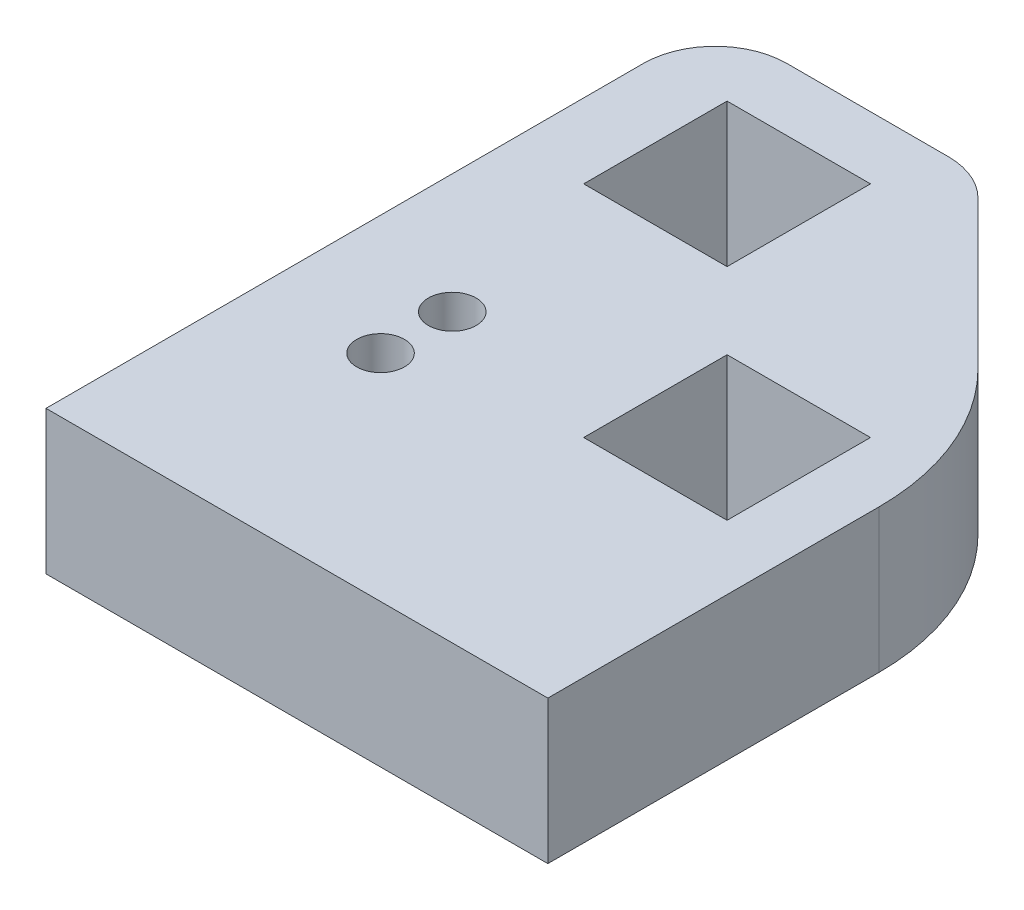
ISO-10303-21;
HEADER;
FILE_DESCRIPTION(('STEP AP214'),'2;1');
FILE_NAME('part.step','',(''),(''),'','','');
FILE_SCHEMA(('AUTOMOTIVE_DESIGN { 1 0 10303 214 1 1 1 1 }'));
ENDSEC;
DATA;
#1=APPLICATION_CONTEXT('core data for automotive mechanical design processes');
#2=APPLICATION_PROTOCOL_DEFINITION('international standard','automotive_design',2000,#1);
#3=PRODUCT_CONTEXT('',#1,'mechanical');
#4=PRODUCT('Part','Part','',(#3));
#5=PRODUCT_RELATED_PRODUCT_CATEGORY('part','',(#4));
#6=PRODUCT_DEFINITION_FORMATION('','',#4);
#7=PRODUCT_DEFINITION_CONTEXT('part definition',#1,'design');
#8=PRODUCT_DEFINITION('design','',#6,#7);
#9=PRODUCT_DEFINITION_SHAPE('','',#8);
#10=(LENGTH_UNIT() NAMED_UNIT(*) SI_UNIT(.MILLI.,.METRE.));
#11=(NAMED_UNIT(*) PLANE_ANGLE_UNIT() SI_UNIT($,.RADIAN.));
#12=(NAMED_UNIT(*) SI_UNIT($,.STERADIAN.) SOLID_ANGLE_UNIT());
#13=UNCERTAINTY_MEASURE_WITH_UNIT(LENGTH_MEASURE(1.E-05),#10,'distance_accuracy_value','');
#14=(GEOMETRIC_REPRESENTATION_CONTEXT(3) GLOBAL_UNCERTAINTY_ASSIGNED_CONTEXT((#13)) GLOBAL_UNIT_ASSIGNED_CONTEXT((#10,
#11,#12)) REPRESENTATION_CONTEXT('',''));
#15=CARTESIAN_POINT('',(0.,0.,0.));
#16=DIRECTION('',(0.,0.,1.));
#17=DIRECTION('',(1.,0.,0.));
#18=AXIS2_PLACEMENT_3D('',#15,#16,#17);
#19=CARTESIAN_POINT('',(0.,6.,0.));
#20=DIRECTION('',(1.,0.,0.));
#21=DIRECTION('',(0.,0.,-1.));
#22=AXIS2_PLACEMENT_3D('',#19,#20,#21);
#23=PLANE('',#22);
#24=DIRECTION('',(0.,0.,1.));
#25=VECTOR('',#24,1.);
#26=CARTESIAN_POINT('',(0.,6.,0.));
#27=LINE('',#26,#25);
#28=CARTESIAN_POINT('',(0.,6.,-25.));
#29=VERTEX_POINT('',#28);
#30=CARTESIAN_POINT('',(0.,6.,0.));
#31=VERTEX_POINT('',#30);
#32=EDGE_CURVE('E232',#29,#31,#27,.T.);
#33=ORIENTED_EDGE('',*,*,#32,.F.);
#34=DIRECTION('',(0.,-1.,0.));
#35=VECTOR('',#34,1.);
#36=CARTESIAN_POINT('',(0.,6.,-25.));
#37=LINE('',#36,#35);
#38=CARTESIAN_POINT('',(0.,0.,-25.));
#39=VERTEX_POINT('',#38);
#40=EDGE_CURVE('E11',#29,#39,#37,.T.);
#41=ORIENTED_EDGE('',*,*,#40,.T.);
#42=DIRECTION('',(0.,0.,1.));
#43=VECTOR('',#42,1.);
#44=CARTESIAN_POINT('',(0.,0.,0.));
#45=LINE('',#44,#43);
#46=CARTESIAN_POINT('',(0.,0.,0.));
#47=VERTEX_POINT('',#46);
#48=EDGE_CURVE('E231',#39,#47,#45,.T.);
#49=ORIENTED_EDGE('',*,*,#48,.T.);
#50=DIRECTION('',(0.,-1.,0.));
#51=VECTOR('',#50,1.);
#52=CARTESIAN_POINT('',(0.,6.,0.));
#53=LINE('',#52,#51);
#54=EDGE_CURVE('E253',#31,#47,#53,.T.);
#55=ORIENTED_EDGE('',*,*,#54,.F.);
#56=EDGE_LOOP('',(#33,#41,#49,#55));
#57=FACE_BOUND('',#56,.T.);
#58=ADVANCED_FACE('F35',(#57),#23,.F.);
#59=CARTESIAN_POINT('',(0.,6.,0.));
#60=DIRECTION('',(0.,0.,-1.));
#61=DIRECTION('',(-1.,0.,0.));
#62=AXIS2_PLACEMENT_3D('',#59,#60,#61);
#63=PLANE('',#62);
#64=DIRECTION('',(1.,0.,0.));
#65=VECTOR('',#64,1.);
#66=CARTESIAN_POINT('',(0.,0.,0.));
#67=LINE('',#66,#65);
#68=CARTESIAN_POINT('',(21.,0.,0.));
#69=VERTEX_POINT('',#68);
#70=EDGE_CURVE('E245',#47,#69,#67,.T.);
#71=ORIENTED_EDGE('',*,*,#70,.T.);
#72=DIRECTION('',(0.,-1.,0.));
#73=VECTOR('',#72,1.);
#74=CARTESIAN_POINT('',(21.,6.,0.));
#75=LINE('',#74,#73);
#76=CARTESIAN_POINT('',(21.,6.,0.));
#77=VERTEX_POINT('',#76);
#78=EDGE_CURVE('E243',#77,#69,#75,.T.);
#79=ORIENTED_EDGE('',*,*,#78,.F.);
#80=DIRECTION('',(1.,0.,0.));
#81=VECTOR('',#80,1.);
#82=CARTESIAN_POINT('',(0.,6.,0.));
#83=LINE('',#82,#81);
#84=EDGE_CURVE('E234',#31,#77,#83,.T.);
#85=ORIENTED_EDGE('',*,*,#84,.F.);
#86=ORIENTED_EDGE('',*,*,#54,.T.);
#87=EDGE_LOOP('',(#71,#79,#85,#86));
#88=FACE_BOUND('',#87,.T.);
#89=ADVANCED_FACE('F301',(#88),#63,.F.);
#90=CARTESIAN_POINT('',(21.,6.,0.));
#91=DIRECTION('',(-1.,0.,0.));
#92=DIRECTION('',(0.,0.,1.));
#93=AXIS2_PLACEMENT_3D('',#90,#91,#92);
#94=PLANE('',#93);
#95=DIRECTION('',(0.,0.,-1.));
#96=VECTOR('',#95,1.);
#97=CARTESIAN_POINT('',(21.,0.,0.));
#98=LINE('',#97,#96);
#99=CARTESIAN_POINT('',(21.,0.,-13.857864376269));
#100=VERTEX_POINT('',#99);
#101=EDGE_CURVE('E247',#69,#100,#98,.T.);
#102=ORIENTED_EDGE('',*,*,#101,.T.);
#103=DIRECTION('',(0.,1.,0.));
#104=VECTOR('',#103,1.);
#105=CARTESIAN_POINT('',(21.,6.,-13.857864376269));
#106=LINE('',#105,#104);
#107=CARTESIAN_POINT('',(21.,6.,-13.857864376269));
#108=VERTEX_POINT('',#107);
#109=EDGE_CURVE('E256',#100,#108,#106,.T.);
#110=ORIENTED_EDGE('',*,*,#109,.T.);
#111=DIRECTION('',(0.,0.,-1.));
#112=VECTOR('',#111,1.);
#113=CARTESIAN_POINT('',(21.,6.,0.));
#114=LINE('',#113,#112);
#115=EDGE_CURVE('E237',#77,#108,#114,.T.);
#116=ORIENTED_EDGE('',*,*,#115,.F.);
#117=ORIENTED_EDGE('',*,*,#78,.T.);
#118=EDGE_LOOP('',(#102,#110,#116,#117));
#119=FACE_BOUND('',#118,.T.);
#120=ADVANCED_FACE('F305',(#119),#94,.F.);
#121=CARTESIAN_POINT('',(0.,6.,-28.));
#122=DIRECTION('',(0.,0.,1.));
#123=DIRECTION('',(1.,0.,0.));
#124=AXIS2_PLACEMENT_3D('',#121,#122,#123);
#125=PLANE('',#124);
#126=DIRECTION('',(-1.,0.,0.));
#127=VECTOR('',#126,1.);
#128=CARTESIAN_POINT('',(0.,6.,-28.));
#129=LINE('',#128,#127);
#130=CARTESIAN_POINT('',(9.75735931288068,6.,-28.));
#131=VERTEX_POINT('',#130);
#132=CARTESIAN_POINT('',(3.,6.,-28.));
#133=VERTEX_POINT('',#132);
#134=EDGE_CURVE('E240',#131,#133,#129,.T.);
#135=ORIENTED_EDGE('',*,*,#134,.F.);
#136=DIRECTION('',(0.,1.,0.));
#137=VECTOR('',#136,1.);
#138=CARTESIAN_POINT('',(9.75735931288068,6.,-28.));
#139=LINE('',#138,#137);
#140=CARTESIAN_POINT('',(9.75735931288068,0.,-28.));
#141=VERTEX_POINT('',#140);
#142=EDGE_CURVE('E276',#131,#141,#139,.F.);
#143=ORIENTED_EDGE('',*,*,#142,.T.);
#144=DIRECTION('',(-1.,0.,0.));
#145=VECTOR('',#144,1.);
#146=CARTESIAN_POINT('',(0.,0.,-28.));
#147=LINE('',#146,#145);
#148=CARTESIAN_POINT('',(3.,0.,-28.));
#149=VERTEX_POINT('',#148);
#150=EDGE_CURVE('E235',#141,#149,#147,.T.);
#151=ORIENTED_EDGE('',*,*,#150,.T.);
#152=DIRECTION('',(0.,-1.,0.));
#153=VECTOR('',#152,1.);
#154=CARTESIAN_POINT('',(3.,6.,-28.));
#155=LINE('',#154,#153);
#156=EDGE_CURVE('E274',#149,#133,#155,.F.);
#157=ORIENTED_EDGE('',*,*,#156,.T.);
#158=EDGE_LOOP('',(#135,#143,#151,#157));
#159=FACE_BOUND('',#158,.T.);
#160=ADVANCED_FACE('F294',(#159),#125,.F.);
#161=CARTESIAN_POINT('',(0.,6.,0.));
#162=DIRECTION('',(0.,-1.,0.));
#163=DIRECTION('',(0.,0.,-1.));
#164=AXIS2_PLACEMENT_3D('',#161,#162,#163);
#165=PLANE('',#164);
#166=CARTESIAN_POINT('',(5.,6.,-9.));
#167=DIRECTION('',(0.,1.,0.));
#168=DIRECTION('',(0.,0.,1.));
#169=AXIS2_PLACEMENT_3D('',#166,#167,#168);
#170=CIRCLE('',#169,1.);
#171=CARTESIAN_POINT('',(5.,6.,-8.));
#172=VERTEX_POINT('',#171);
#173=EDGE_CURVE('E377',#172,#172,#170,.T.);
#174=ORIENTED_EDGE('',*,*,#173,.F.);
#175=EDGE_LOOP('',(#174));
#176=FACE_BOUND('',#175,.T.);
#177=CARTESIAN_POINT('',(5.,6.,-12.));
#178=DIRECTION('',(0.,1.,0.));
#179=DIRECTION('',(0.,0.,1.));
#180=AXIS2_PLACEMENT_3D('',#177,#178,#179);
#181=CIRCLE('',#180,1.);
#182=CARTESIAN_POINT('',(5.,6.,-11.));
#183=VERTEX_POINT('',#182);
#184=EDGE_CURVE('E180',#183,#183,#181,.T.);
#185=ORIENTED_EDGE('',*,*,#184,.F.);
#186=EDGE_LOOP('',(#185));
#187=FACE_BOUND('',#186,.T.);
#188=DIRECTION('',(1.,0.,0.));
#189=VECTOR('',#188,1.);
#190=CARTESIAN_POINT('',(12.3076118445749,6.,-10.1923881554251));
#191=LINE('',#190,#189);
#192=CARTESIAN_POINT('',(12.3076118445749,6.,-10.1923881554251));
#193=VERTEX_POINT('',#192);
#194=CARTESIAN_POINT('',(18.3076118445749,6.,-10.1923881554251));
#195=VERTEX_POINT('',#194);
#196=EDGE_CURVE('E177',#193,#195,#191,.T.);
#197=ORIENTED_EDGE('',*,*,#196,.F.);
#198=DIRECTION('',(0.,0.,1.));
#199=VECTOR('',#198,1.);
#200=CARTESIAN_POINT('',(12.3076118445749,6.,-16.1923881554251));
#201=LINE('',#200,#199);
#202=CARTESIAN_POINT('',(12.3076118445749,6.,-16.1923881554251));
#203=VERTEX_POINT('',#202);
#204=EDGE_CURVE('E164',#203,#193,#201,.T.);
#205=ORIENTED_EDGE('',*,*,#204,.F.);
#206=DIRECTION('',(-1.,0.,0.));
#207=VECTOR('',#206,1.);
#208=CARTESIAN_POINT('',(12.3076118445749,6.,-16.1923881554251));
#209=LINE('',#208,#207);
#210=CARTESIAN_POINT('',(18.3076118445749,6.,-16.1923881554251));
#211=VERTEX_POINT('',#210);
#212=EDGE_CURVE('E212',#211,#203,#209,.T.);
#213=ORIENTED_EDGE('',*,*,#212,.F.);
#214=DIRECTION('',(0.,0.,-1.));
#215=VECTOR('',#214,1.);
#216=CARTESIAN_POINT('',(18.3076118445749,6.,-16.1923881554251));
#217=LINE('',#216,#215);
#218=EDGE_CURVE('E173',#195,#211,#217,.T.);
#219=ORIENTED_EDGE('',*,*,#218,.F.);
#220=EDGE_LOOP('',(#197,#205,#213,#219));
#221=FACE_BOUND('',#220,.T.);
#222=DIRECTION('',(1.,0.,0.));
#223=VECTOR('',#222,1.);
#224=CARTESIAN_POINT('',(3.11522368914977,6.,-19.3847763108502));
#225=LINE('',#224,#223);
#226=CARTESIAN_POINT('',(3.11522368914977,6.,-19.3847763108502));
#227=VERTEX_POINT('',#226);
#228=CARTESIAN_POINT('',(9.11522368914977,6.,-19.3847763108502));
#229=VERTEX_POINT('',#228);
#230=EDGE_CURVE('E188',#227,#229,#225,.T.);
#231=ORIENTED_EDGE('',*,*,#230,.F.);
#232=DIRECTION('',(0.,0.,1.));
#233=VECTOR('',#232,1.);
#234=CARTESIAN_POINT('',(3.11522368914977,6.,-25.3847763108502));
#235=LINE('',#234,#233);
#236=CARTESIAN_POINT('',(3.11522368914977,6.,-25.3847763108502));
#237=VERTEX_POINT('',#236);
#238=EDGE_CURVE('E224',#237,#227,#235,.T.);
#239=ORIENTED_EDGE('',*,*,#238,.F.);
#240=DIRECTION('',(-1.,0.,0.));
#241=VECTOR('',#240,1.);
#242=CARTESIAN_POINT('',(3.11522368914977,6.,-25.3847763108502));
#243=LINE('',#242,#241);
#244=CARTESIAN_POINT('',(9.11522368914977,6.,-25.3847763108502));
#245=VERTEX_POINT('',#244);
#246=EDGE_CURVE('E219',#245,#237,#243,.T.);
#247=ORIENTED_EDGE('',*,*,#246,.F.);
#248=DIRECTION('',(0.,0.,-1.));
#249=VECTOR('',#248,1.);
#250=CARTESIAN_POINT('',(9.11522368914977,6.,-25.3847763108502));
#251=LINE('',#250,#249);
#252=EDGE_CURVE('E194',#229,#245,#251,.T.);
#253=ORIENTED_EDGE('',*,*,#252,.F.);
#254=EDGE_LOOP('',(#231,#239,#247,#253));
#255=FACE_BOUND('',#254,.T.);
#256=DIRECTION('',(0.707106781186549,0.,0.707106781186546));
#257=VECTOR('',#256,1.);
#258=CARTESIAN_POINT('',(21.,6.,-18.));
#259=LINE('',#258,#257);
#260=CARTESIAN_POINT('',(11.8786796564403,6.,-27.1213203435596));
#261=VERTEX_POINT('',#260);
#262=CARTESIAN_POINT('',(18.0710678118655,6.,-20.9289321881345));
#263=VERTEX_POINT('',#262);
#264=EDGE_CURVE('E205',#261,#263,#259,.T.);
#265=ORIENTED_EDGE('',*,*,#264,.F.);
#266=CARTESIAN_POINT('',(9.75735931288068,6.,-25.));
#267=DIRECTION('',(0.,-1.,0.));
#268=DIRECTION('',(0.,0.,-1.));
#269=AXIS2_PLACEMENT_3D('',#266,#267,#268);
#270=CIRCLE('',#269,3.);
#271=EDGE_CURVE('E272',#261,#131,#270,.F.);
#272=ORIENTED_EDGE('',*,*,#271,.T.);
#273=ORIENTED_EDGE('',*,*,#134,.T.);
#274=CARTESIAN_POINT('',(3.,6.,-25.));
#275=DIRECTION('',(0.,-1.,0.));
#276=DIRECTION('',(0.,0.,-1.));
#277=AXIS2_PLACEMENT_3D('',#274,#275,#276);
#278=CIRCLE('',#277,3.);
#279=EDGE_CURVE('E270',#133,#29,#278,.F.);
#280=ORIENTED_EDGE('',*,*,#279,.T.);
#281=ORIENTED_EDGE('',*,*,#32,.T.);
#282=ORIENTED_EDGE('',*,*,#84,.T.);
#283=ORIENTED_EDGE('',*,*,#115,.T.);
#284=CARTESIAN_POINT('',(11.,6.,-13.857864376269));
#285=DIRECTION('',(0.,-1.,0.));
#286=DIRECTION('',(0.,0.,-1.));
#287=AXIS2_PLACEMENT_3D('',#284,#285,#286);
#288=CIRCLE('',#287,10.);
#289=EDGE_CURVE('E259',#108,#263,#288,.F.);
#290=ORIENTED_EDGE('',*,*,#289,.T.);
#291=EDGE_LOOP('',(#265,#272,#273,#280,#281,#282,#283,#290));
#292=FACE_BOUND('',#291,.T.);
#293=ADVANCED_FACE('F291',(#176,#187,#221,#255,#292),#165,.F.);
#294=CARTESIAN_POINT('',(0.,0.,0.));
#295=DIRECTION('',(0.,-1.,0.));
#296=DIRECTION('',(0.,0.,-1.));
#297=AXIS2_PLACEMENT_3D('',#294,#295,#296);
#298=PLANE('',#297);
#299=CARTESIAN_POINT('',(5.,0.,-9.));
#300=DIRECTION('',(0.,1.,0.));
#301=DIRECTION('',(0.,0.,1.));
#302=AXIS2_PLACEMENT_3D('',#299,#300,#301);
#303=CIRCLE('',#302,1.);
#304=CARTESIAN_POINT('',(5.,0.,-8.));
#305=VERTEX_POINT('',#304);
#306=EDGE_CURVE('E374',#305,#305,#303,.T.);
#307=ORIENTED_EDGE('',*,*,#306,.T.);
#308=EDGE_LOOP('',(#307));
#309=FACE_BOUND('',#308,.T.);
#310=CARTESIAN_POINT('',(5.,0.,-12.));
#311=DIRECTION('',(0.,1.,0.));
#312=DIRECTION('',(0.,0.,1.));
#313=AXIS2_PLACEMENT_3D('',#310,#311,#312);
#314=CIRCLE('',#313,1.);
#315=CARTESIAN_POINT('',(5.,0.,-11.));
#316=VERTEX_POINT('',#315);
#317=EDGE_CURVE('E183',#316,#316,#314,.T.);
#318=ORIENTED_EDGE('',*,*,#317,.T.);
#319=EDGE_LOOP('',(#318));
#320=FACE_BOUND('',#319,.T.);
#321=DIRECTION('',(0.,0.,1.));
#322=VECTOR('',#321,1.);
#323=CARTESIAN_POINT('',(12.3076118445749,0.,-16.1923881554251));
#324=LINE('',#323,#322);
#325=CARTESIAN_POINT('',(12.3076118445749,0.,-16.1923881554251));
#326=VERTEX_POINT('',#325);
#327=CARTESIAN_POINT('',(12.3076118445749,0.,-10.1923881554251));
#328=VERTEX_POINT('',#327);
#329=EDGE_CURVE('E148',#326,#328,#324,.T.);
#330=ORIENTED_EDGE('',*,*,#329,.T.);
#331=DIRECTION('',(1.,0.,0.));
#332=VECTOR('',#331,1.);
#333=CARTESIAN_POINT('',(12.3076118445749,0.,-10.1923881554251));
#334=LINE('',#333,#332);
#335=CARTESIAN_POINT('',(18.3076118445749,0.,-10.1923881554251));
#336=VERTEX_POINT('',#335);
#337=EDGE_CURVE('E154',#328,#336,#334,.T.);
#338=ORIENTED_EDGE('',*,*,#337,.T.);
#339=DIRECTION('',(0.,0.,-1.));
#340=VECTOR('',#339,1.);
#341=CARTESIAN_POINT('',(18.3076118445749,0.,-16.1923881554251));
#342=LINE('',#341,#340);
#343=CARTESIAN_POINT('',(18.3076118445749,0.,-16.1923881554251));
#344=VERTEX_POINT('',#343);
#345=EDGE_CURVE('E169',#336,#344,#342,.T.);
#346=ORIENTED_EDGE('',*,*,#345,.T.);
#347=DIRECTION('',(-1.,0.,0.));
#348=VECTOR('',#347,1.);
#349=CARTESIAN_POINT('',(12.3076118445749,0.,-16.1923881554251));
#350=LINE('',#349,#348);
#351=EDGE_CURVE('E155',#344,#326,#350,.T.);
#352=ORIENTED_EDGE('',*,*,#351,.T.);
#353=EDGE_LOOP('',(#330,#338,#346,#352));
#354=FACE_BOUND('',#353,.T.);
#355=DIRECTION('',(0.,0.,1.));
#356=VECTOR('',#355,1.);
#357=CARTESIAN_POINT('',(3.11522368914977,0.,-25.3847763108502));
#358=LINE('',#357,#356);
#359=CARTESIAN_POINT('',(3.11522368914977,0.,-25.3847763108502));
#360=VERTEX_POINT('',#359);
#361=CARTESIAN_POINT('',(3.11522368914977,0.,-19.3847763108502));
#362=VERTEX_POINT('',#361);
#363=EDGE_CURVE('E223',#360,#362,#358,.T.);
#364=ORIENTED_EDGE('',*,*,#363,.T.);
#365=DIRECTION('',(1.,0.,0.));
#366=VECTOR('',#365,1.);
#367=CARTESIAN_POINT('',(3.11522368914977,0.,-19.3847763108502));
#368=LINE('',#367,#366);
#369=CARTESIAN_POINT('',(9.11522368914977,0.,-19.3847763108502));
#370=VERTEX_POINT('',#369);
#371=EDGE_CURVE('E190',#362,#370,#368,.T.);
#372=ORIENTED_EDGE('',*,*,#371,.T.);
#373=DIRECTION('',(0.,0.,-1.));
#374=VECTOR('',#373,1.);
#375=CARTESIAN_POINT('',(9.11522368914977,0.,-25.3847763108502));
#376=LINE('',#375,#374);
#377=CARTESIAN_POINT('',(9.11522368914977,0.,-25.3847763108502));
#378=VERTEX_POINT('',#377);
#379=EDGE_CURVE('E193',#370,#378,#376,.T.);
#380=ORIENTED_EDGE('',*,*,#379,.T.);
#381=DIRECTION('',(-1.,0.,0.));
#382=VECTOR('',#381,1.);
#383=CARTESIAN_POINT('',(3.11522368914977,0.,-25.3847763108502));
#384=LINE('',#383,#382);
#385=EDGE_CURVE('E220',#378,#360,#384,.T.);
#386=ORIENTED_EDGE('',*,*,#385,.T.);
#387=EDGE_LOOP('',(#364,#372,#380,#386));
#388=FACE_BOUND('',#387,.T.);
#389=ORIENTED_EDGE('',*,*,#150,.F.);
#390=CARTESIAN_POINT('',(9.75735931288068,0.,-25.));
#391=DIRECTION('',(0.,-1.,0.));
#392=DIRECTION('',(0.,0.,-1.));
#393=AXIS2_PLACEMENT_3D('',#390,#391,#392);
#394=CIRCLE('',#393,3.);
#395=CARTESIAN_POINT('',(11.8786796564403,0.,-27.1213203435596));
#396=VERTEX_POINT('',#395);
#397=EDGE_CURVE('E43',#141,#396,#394,.T.);
#398=ORIENTED_EDGE('',*,*,#397,.T.);
#399=DIRECTION('',(0.707106781186549,0.,0.707106781186546));
#400=VECTOR('',#399,1.);
#401=CARTESIAN_POINT('',(21.,0.,-18.));
#402=LINE('',#401,#400);
#403=CARTESIAN_POINT('',(18.0710678118655,0.,-20.9289321881345));
#404=VERTEX_POINT('',#403);
#405=EDGE_CURVE('E210',#396,#404,#402,.T.);
#406=ORIENTED_EDGE('',*,*,#405,.T.);
#407=CARTESIAN_POINT('',(11.,0.,-13.857864376269));
#408=DIRECTION('',(0.,-1.,0.));
#409=DIRECTION('',(0.,0.,-1.));
#410=AXIS2_PLACEMENT_3D('',#407,#408,#409);
#411=CIRCLE('',#410,10.);
#412=EDGE_CURVE('E265',#404,#100,#411,.T.);
#413=ORIENTED_EDGE('',*,*,#412,.T.);
#414=ORIENTED_EDGE('',*,*,#101,.F.);
#415=ORIENTED_EDGE('',*,*,#70,.F.);
#416=ORIENTED_EDGE('',*,*,#48,.F.);
#417=CARTESIAN_POINT('',(3.,0.,-25.));
#418=DIRECTION('',(0.,-1.,0.));
#419=DIRECTION('',(0.,0.,-1.));
#420=AXIS2_PLACEMENT_3D('',#417,#418,#419);
#421=CIRCLE('',#420,3.);
#422=EDGE_CURVE('E50',#39,#149,#421,.T.);
#423=ORIENTED_EDGE('',*,*,#422,.T.);
#424=EDGE_LOOP('',(#389,#398,#406,#413,#414,#415,#416,#423));
#425=FACE_BOUND('',#424,.T.);
#426=ADVANCED_FACE('F150',(#309,#320,#354,#388,#425),#298,.T.);
#427=CARTESIAN_POINT('',(3.11522368914977,0.,-25.3847763108502));
#428=DIRECTION('',(-1.,0.,0.));
#429=DIRECTION('',(0.,0.,1.));
#430=AXIS2_PLACEMENT_3D('',#427,#428,#429);
#431=PLANE('',#430);
#432=ORIENTED_EDGE('',*,*,#238,.T.);
#433=DIRECTION('',(0.,1.,0.));
#434=VECTOR('',#433,1.);
#435=CARTESIAN_POINT('',(3.11522368914977,0.,-19.3847763108502));
#436=LINE('',#435,#434);
#437=EDGE_CURVE('E197',#362,#227,#436,.T.);
#438=ORIENTED_EDGE('',*,*,#437,.F.);
#439=ORIENTED_EDGE('',*,*,#363,.F.);
#440=DIRECTION('',(0.,1.,0.));
#441=VECTOR('',#440,1.);
#442=CARTESIAN_POINT('',(3.11522368914977,0.,-25.3847763108502));
#443=LINE('',#442,#441);
#444=EDGE_CURVE('E226',#360,#237,#443,.T.);
#445=ORIENTED_EDGE('',*,*,#444,.T.);
#446=EDGE_LOOP('',(#432,#438,#439,#445));
#447=FACE_BOUND('',#446,.T.);
#448=ADVANCED_FACE('F331',(#447),#431,.F.);
#449=CARTESIAN_POINT('',(3.11522368914977,0.,-25.3847763108502));
#450=DIRECTION('',(0.,0.,-1.));
#451=DIRECTION('',(-1.,0.,0.));
#452=AXIS2_PLACEMENT_3D('',#449,#450,#451);
#453=PLANE('',#452);
#454=ORIENTED_EDGE('',*,*,#246,.T.);
#455=ORIENTED_EDGE('',*,*,#444,.F.);
#456=ORIENTED_EDGE('',*,*,#385,.F.);
#457=DIRECTION('',(0.,1.,0.));
#458=VECTOR('',#457,1.);
#459=CARTESIAN_POINT('',(9.11522368914977,0.,-25.3847763108502));
#460=LINE('',#459,#458);
#461=EDGE_CURVE('E202',#378,#245,#460,.T.);
#462=ORIENTED_EDGE('',*,*,#461,.T.);
#463=EDGE_LOOP('',(#454,#455,#456,#462));
#464=FACE_BOUND('',#463,.T.);
#465=ADVANCED_FACE('F336',(#464),#453,.F.);
#466=CARTESIAN_POINT('',(12.3076118445749,0.,-16.1923881554251));
#467=DIRECTION('',(-1.,0.,0.));
#468=DIRECTION('',(0.,0.,1.));
#469=AXIS2_PLACEMENT_3D('',#466,#467,#468);
#470=PLANE('',#469);
#471=ORIENTED_EDGE('',*,*,#204,.T.);
#472=DIRECTION('',(0.,1.,0.));
#473=VECTOR('',#472,1.);
#474=CARTESIAN_POINT('',(12.3076118445749,0.,-10.1923881554251));
#475=LINE('',#474,#473);
#476=EDGE_CURVE('E161',#328,#193,#475,.T.);
#477=ORIENTED_EDGE('',*,*,#476,.F.);
#478=ORIENTED_EDGE('',*,*,#329,.F.);
#479=DIRECTION('',(0.,1.,0.));
#480=VECTOR('',#479,1.);
#481=CARTESIAN_POINT('',(12.3076118445749,0.,-16.1923881554251));
#482=LINE('',#481,#480);
#483=EDGE_CURVE('E158',#326,#203,#482,.T.);
#484=ORIENTED_EDGE('',*,*,#483,.T.);
#485=EDGE_LOOP('',(#471,#477,#478,#484));
#486=FACE_BOUND('',#485,.T.);
#487=ADVANCED_FACE('F162',(#486),#470,.F.);
#488=CARTESIAN_POINT('',(12.3076118445749,0.,-16.1923881554251));
#489=DIRECTION('',(0.,0.,-1.));
#490=DIRECTION('',(-1.,0.,0.));
#491=AXIS2_PLACEMENT_3D('',#488,#489,#490);
#492=PLANE('',#491);
#493=ORIENTED_EDGE('',*,*,#212,.T.);
#494=ORIENTED_EDGE('',*,*,#483,.F.);
#495=ORIENTED_EDGE('',*,*,#351,.F.);
#496=DIRECTION('',(0.,1.,0.));
#497=VECTOR('',#496,1.);
#498=CARTESIAN_POINT('',(18.3076118445749,0.,-16.1923881554251));
#499=LINE('',#498,#497);
#500=EDGE_CURVE('E185',#344,#211,#499,.T.);
#501=ORIENTED_EDGE('',*,*,#500,.T.);
#502=EDGE_LOOP('',(#493,#494,#495,#501));
#503=FACE_BOUND('',#502,.T.);
#504=ADVANCED_FACE('F343',(#503),#492,.F.);
#505=CARTESIAN_POINT('',(21.,0.,-18.));
#506=DIRECTION('',(-0.707106781186546,0.,0.707106781186549));
#507=DIRECTION('',(0.707106781186549,0.,0.707106781186546));
#508=AXIS2_PLACEMENT_3D('',#505,#506,#507);
#509=PLANE('',#508);
#510=ORIENTED_EDGE('',*,*,#405,.F.);
#511=DIRECTION('',(0.,1.,0.));
#512=VECTOR('',#511,1.);
#513=CARTESIAN_POINT('',(11.8786796564403,0.,-27.1213203435596));
#514=LINE('',#513,#512);
#515=EDGE_CURVE('E267',#396,#261,#514,.T.);
#516=ORIENTED_EDGE('',*,*,#515,.T.);
#517=ORIENTED_EDGE('',*,*,#264,.T.);
#518=DIRECTION('',(0.,1.,0.));
#519=VECTOR('',#518,1.);
#520=CARTESIAN_POINT('',(18.0710678118655,0.,-20.9289321881345));
#521=LINE('',#520,#519);
#522=EDGE_CURVE('E262',#263,#404,#521,.F.);
#523=ORIENTED_EDGE('',*,*,#522,.T.);
#524=EDGE_LOOP('',(#510,#516,#517,#523));
#525=FACE_BOUND('',#524,.T.);
#526=ADVANCED_FACE('F284',(#525),#509,.F.);
#527=CARTESIAN_POINT('',(9.11522368914977,0.,-25.3847763108502));
#528=DIRECTION('',(1.,0.,0.));
#529=DIRECTION('',(0.,0.,-1.));
#530=AXIS2_PLACEMENT_3D('',#527,#528,#529);
#531=PLANE('',#530);
#532=ORIENTED_EDGE('',*,*,#252,.T.);
#533=ORIENTED_EDGE('',*,*,#461,.F.);
#534=ORIENTED_EDGE('',*,*,#379,.F.);
#535=DIRECTION('',(0.,1.,0.));
#536=VECTOR('',#535,1.);
#537=CARTESIAN_POINT('',(9.11522368914977,0.,-19.3847763108502));
#538=LINE('',#537,#536);
#539=EDGE_CURVE('E206',#370,#229,#538,.T.);
#540=ORIENTED_EDGE('',*,*,#539,.T.);
#541=EDGE_LOOP('',(#532,#533,#534,#540));
#542=FACE_BOUND('',#541,.T.);
#543=ADVANCED_FACE('F351',(#542),#531,.F.);
#544=CARTESIAN_POINT('',(3.11522368914977,0.,-19.3847763108502));
#545=DIRECTION('',(0.,0.,1.));
#546=DIRECTION('',(1.,0.,0.));
#547=AXIS2_PLACEMENT_3D('',#544,#545,#546);
#548=PLANE('',#547);
#549=ORIENTED_EDGE('',*,*,#230,.T.);
#550=ORIENTED_EDGE('',*,*,#539,.F.);
#551=ORIENTED_EDGE('',*,*,#371,.F.);
#552=ORIENTED_EDGE('',*,*,#437,.T.);
#553=EDGE_LOOP('',(#549,#550,#551,#552));
#554=FACE_BOUND('',#553,.T.);
#555=ADVANCED_FACE('F352',(#554),#548,.F.);
#556=CARTESIAN_POINT('',(18.3076118445749,0.,-16.1923881554251));
#557=DIRECTION('',(1.,0.,0.));
#558=DIRECTION('',(0.,0.,-1.));
#559=AXIS2_PLACEMENT_3D('',#556,#557,#558);
#560=PLANE('',#559);
#561=ORIENTED_EDGE('',*,*,#218,.T.);
#562=ORIENTED_EDGE('',*,*,#500,.F.);
#563=ORIENTED_EDGE('',*,*,#345,.F.);
#564=DIRECTION('',(0.,1.,0.));
#565=VECTOR('',#564,1.);
#566=CARTESIAN_POINT('',(18.3076118445749,0.,-10.1923881554251));
#567=LINE('',#566,#565);
#568=EDGE_CURVE('E168',#336,#195,#567,.T.);
#569=ORIENTED_EDGE('',*,*,#568,.T.);
#570=EDGE_LOOP('',(#561,#562,#563,#569));
#571=FACE_BOUND('',#570,.T.);
#572=ADVANCED_FACE('F316',(#571),#560,.F.);
#573=CARTESIAN_POINT('',(12.3076118445749,0.,-10.1923881554251));
#574=DIRECTION('',(0.,0.,1.));
#575=DIRECTION('',(1.,0.,0.));
#576=AXIS2_PLACEMENT_3D('',#573,#574,#575);
#577=PLANE('',#576);
#578=ORIENTED_EDGE('',*,*,#196,.T.);
#579=ORIENTED_EDGE('',*,*,#568,.F.);
#580=ORIENTED_EDGE('',*,*,#337,.F.);
#581=ORIENTED_EDGE('',*,*,#476,.T.);
#582=EDGE_LOOP('',(#578,#579,#580,#581));
#583=FACE_BOUND('',#582,.T.);
#584=ADVANCED_FACE('F171',(#583),#577,.F.);
#585=CARTESIAN_POINT('',(11.,6.,-13.857864376269));
#586=DIRECTION('',(0.,1.,0.));
#587=DIRECTION('',(0.,0.,1.));
#588=AXIS2_PLACEMENT_3D('',#585,#586,#587);
#589=CYLINDRICAL_SURFACE('',#588,10.);
#590=ORIENTED_EDGE('',*,*,#412,.F.);
#591=ORIENTED_EDGE('',*,*,#522,.F.);
#592=ORIENTED_EDGE('',*,*,#289,.F.);
#593=ORIENTED_EDGE('',*,*,#109,.F.);
#594=EDGE_LOOP('',(#590,#591,#592,#593));
#595=FACE_BOUND('',#594,.T.);
#596=ADVANCED_FACE('F309',(#595),#589,.T.);
#597=CARTESIAN_POINT('',(9.75735931288068,0.,-25.));
#598=DIRECTION('',(0.,1.,0.));
#599=DIRECTION('',(0.,0.,1.));
#600=AXIS2_PLACEMENT_3D('',#597,#598,#599);
#601=CYLINDRICAL_SURFACE('',#600,3.);
#602=ORIENTED_EDGE('',*,*,#397,.F.);
#603=ORIENTED_EDGE('',*,*,#142,.F.);
#604=ORIENTED_EDGE('',*,*,#271,.F.);
#605=ORIENTED_EDGE('',*,*,#515,.F.);
#606=EDGE_LOOP('',(#602,#603,#604,#605));
#607=FACE_BOUND('',#606,.T.);
#608=ADVANCED_FACE('F288',(#607),#601,.T.);
#609=CARTESIAN_POINT('',(3.,6.,-25.));
#610=DIRECTION('',(0.,-1.,0.));
#611=DIRECTION('',(0.,0.,-1.));
#612=AXIS2_PLACEMENT_3D('',#609,#610,#611);
#613=CYLINDRICAL_SURFACE('',#612,3.);
#614=ORIENTED_EDGE('',*,*,#279,.F.);
#615=ORIENTED_EDGE('',*,*,#156,.F.);
#616=ORIENTED_EDGE('',*,*,#422,.F.);
#617=ORIENTED_EDGE('',*,*,#40,.F.);
#618=EDGE_LOOP('',(#614,#615,#616,#617));
#619=FACE_BOUND('',#618,.T.);
#620=ADVANCED_FACE('F37',(#619),#613,.T.);
#621=CARTESIAN_POINT('',(5.,0.,-12.));
#622=DIRECTION('',(0.,1.,0.));
#623=DIRECTION('',(0.,0.,1.));
#624=AXIS2_PLACEMENT_3D('',#621,#622,#623);
#625=CYLINDRICAL_SURFACE('',#624,1.);
#626=ORIENTED_EDGE('',*,*,#317,.F.);
#627=EDGE_LOOP('',(#626));
#628=FACE_BOUND('',#627,.T.);
#629=ORIENTED_EDGE('',*,*,#184,.T.);
#630=EDGE_LOOP('',(#629));
#631=FACE_BOUND('',#630,.T.);
#632=ADVANCED_FACE('F362',(#628,#631),#625,.F.);
#633=CARTESIAN_POINT('',(5.,0.,-9.));
#634=DIRECTION('',(0.,1.,0.));
#635=DIRECTION('',(0.,0.,1.));
#636=AXIS2_PLACEMENT_3D('',#633,#634,#635);
#637=CYLINDRICAL_SURFACE('',#636,1.);
#638=ORIENTED_EDGE('',*,*,#306,.F.);
#639=EDGE_LOOP('',(#638));
#640=FACE_BOUND('',#639,.T.);
#641=ORIENTED_EDGE('',*,*,#173,.T.);
#642=EDGE_LOOP('',(#641));
#643=FACE_BOUND('',#642,.T.);
#644=ADVANCED_FACE('F365',(#640,#643),#637,.F.);
#645=CLOSED_SHELL('',(#58,#89,#120,#160,#293,#426,#448,#465,#487,#504,#526,#543,#555,#572,#584,
#596,#608,#620,#632,#644));
#646=MANIFOLD_SOLID_BREP('B2',#645);
#647=ADVANCED_BREP_SHAPE_REPRESENTATION('',(#18,#646),#14);
#648=SHAPE_DEFINITION_REPRESENTATION(#9,#647);
ENDSEC;
END-ISO-10303-21;
